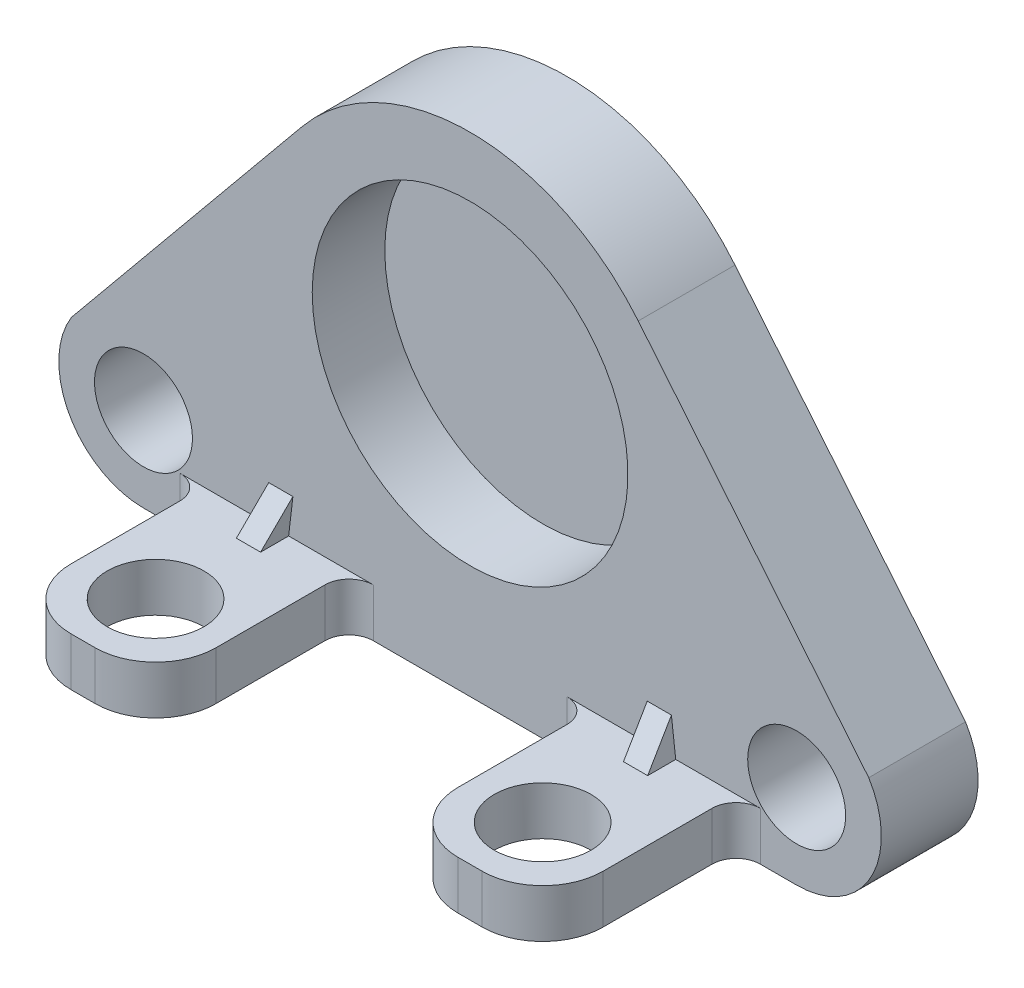
ISO-10303-21;
HEADER;
FILE_DESCRIPTION(('STEP AP214'),'2;1');
FILE_NAME('part.step','',(''),(''),'','','');
FILE_SCHEMA(('AUTOMOTIVE_DESIGN { 1 0 10303 214 1 1 1 1 }'));
ENDSEC;
DATA;
#1=APPLICATION_CONTEXT('core data for automotive mechanical design processes');
#2=APPLICATION_PROTOCOL_DEFINITION('international standard','automotive_design',2000,#1);
#3=PRODUCT_CONTEXT('',#1,'mechanical');
#4=PRODUCT('Part','Part','',(#3));
#5=PRODUCT_RELATED_PRODUCT_CATEGORY('part','',(#4));
#6=PRODUCT_DEFINITION_FORMATION('','',#4);
#7=PRODUCT_DEFINITION_CONTEXT('part definition',#1,'design');
#8=PRODUCT_DEFINITION('design','',#6,#7);
#9=PRODUCT_DEFINITION_SHAPE('','',#8);
#10=(LENGTH_UNIT() NAMED_UNIT(*) SI_UNIT(.MILLI.,.METRE.));
#11=(NAMED_UNIT(*) PLANE_ANGLE_UNIT() SI_UNIT($,.RADIAN.));
#12=(NAMED_UNIT(*) SI_UNIT($,.STERADIAN.) SOLID_ANGLE_UNIT());
#13=UNCERTAINTY_MEASURE_WITH_UNIT(LENGTH_MEASURE(1.E-05),#10,'distance_accuracy_value','');
#14=(GEOMETRIC_REPRESENTATION_CONTEXT(3) GLOBAL_UNCERTAINTY_ASSIGNED_CONTEXT((#13)) GLOBAL_UNIT_ASSIGNED_CONTEXT((#10,
#11,#12)) REPRESENTATION_CONTEXT('',''));
#15=CARTESIAN_POINT('',(0.,0.,0.));
#16=DIRECTION('',(0.,0.,1.));
#17=DIRECTION('',(1.,0.,0.));
#18=AXIS2_PLACEMENT_3D('',#15,#16,#17);
#19=CARTESIAN_POINT('',(-27.,-21.6152521873631,-25.));
#20=DIRECTION('',(0.,0.,-1.));
#21=DIRECTION('',(-1.,0.,0.));
#22=AXIS2_PLACEMENT_3D('',#19,#20,#21);
#23=PLANE('',#22);
#24=CARTESIAN_POINT('',(0.,-6.2,-25.));
#25=DIRECTION('',(0.,0.,-1.));
#26=DIRECTION('',(-1.,0.,0.));
#27=AXIS2_PLACEMENT_3D('',#24,#25,#26);
#28=CIRCLE('',#27,13.05);
#29=CARTESIAN_POINT('',(-13.05,-6.2,-25.));
#30=VERTEX_POINT('',#29);
#31=EDGE_CURVE('E378',#30,#30,#28,.T.);
#32=ORIENTED_EDGE('',*,*,#31,.T.);
#33=EDGE_LOOP('',(#32));
#34=FACE_BOUND('',#33,.T.);
#35=CARTESIAN_POINT('',(-27.,-21.6152521873631,-25.));
#36=DIRECTION('',(0.,0.,-1.));
#37=DIRECTION('',(1.,0.,0.));
#38=AXIS2_PLACEMENT_3D('',#35,#36,#37);
#39=CIRCLE('',#38,4.05);
#40=CARTESIAN_POINT('',(-22.95,-21.6152521873631,-25.));
#41=VERTEX_POINT('',#40);
#42=EDGE_CURVE('E383',#41,#41,#39,.T.);
#43=ORIENTED_EDGE('',*,*,#42,.T.);
#44=EDGE_LOOP('',(#43));
#45=FACE_BOUND('',#44,.T.);
#46=CARTESIAN_POINT('',(27.,-21.6152521873631,-25.));
#47=DIRECTION('',(0.,0.,-1.));
#48=DIRECTION('',(-1.,0.,0.));
#49=AXIS2_PLACEMENT_3D('',#46,#47,#48);
#50=CIRCLE('',#49,4.05);
#51=CARTESIAN_POINT('',(22.95,-21.6152521873631,-25.));
#52=VERTEX_POINT('',#51);
#53=EDGE_CURVE('E386',#52,#52,#50,.T.);
#54=ORIENTED_EDGE('',*,*,#53,.T.);
#55=EDGE_LOOP('',(#54));
#56=FACE_BOUND('',#55,.T.);
#57=DIRECTION('',(-1.,0.,0.));
#58=VECTOR('',#57,1.);
#59=CARTESIAN_POINT('',(22.,-24.615252187363,-25.));
#60=LINE('',#59,#58);
#61=CARTESIAN_POINT('',(15.,-24.6152521873631,-25.));
#62=VERTEX_POINT('',#61);
#63=CARTESIAN_POINT('',(8.00000000000001,-24.6152521873631,-25.));
#64=VERTEX_POINT('',#63);
#65=EDGE_CURVE('E36',#62,#64,#60,.T.);
#66=ORIENTED_EDGE('',*,*,#65,.F.);
#67=DIRECTION('',(-0.11733907517707,0.993091909863629,0.));
#68=VECTOR('',#67,1.);
#69=CARTESIAN_POINT('',(15.,-24.6152521873631,-25.));
#70=LINE('',#69,#68);
#71=CARTESIAN_POINT('',(14.6455340920262,-21.6152521873631,-25.));
#72=VERTEX_POINT('',#71);
#73=EDGE_CURVE('E283',#62,#72,#70,.T.);
#74=ORIENTED_EDGE('',*,*,#73,.T.);
#75=DIRECTION('',(-1.,0.,0.));
#76=VECTOR('',#75,1.);
#77=CARTESIAN_POINT('',(16.6455340920262,-21.6152521873631,-25.));
#78=LINE('',#77,#76);
#79=CARTESIAN_POINT('',(16.6455340920262,-21.6152521873631,-25.));
#80=VERTEX_POINT('',#79);
#81=EDGE_CURVE('E282',#80,#72,#78,.T.);
#82=ORIENTED_EDGE('',*,*,#81,.F.);
#83=DIRECTION('',(-0.11733907517707,0.993091909863629,0.));
#84=VECTOR('',#83,1.);
#85=CARTESIAN_POINT('',(17.,-24.6152521873631,-25.));
#86=LINE('',#85,#84);
#87=CARTESIAN_POINT('',(17.,-24.6152521873631,-25.));
#88=VERTEX_POINT('',#87);
#89=EDGE_CURVE('E279',#88,#80,#86,.T.);
#90=ORIENTED_EDGE('',*,*,#89,.F.);
#91=CARTESIAN_POINT('',(24.,-24.615252187363,-25.));
#92=VERTEX_POINT('',#91);
#93=EDGE_CURVE('E350',#92,#88,#60,.T.);
#94=ORIENTED_EDGE('',*,*,#93,.F.);
#95=DIRECTION('',(0.,1.,0.));
#96=VECTOR('',#95,1.);
#97=CARTESIAN_POINT('',(24.,-28.615252187363,-25.));
#98=LINE('',#97,#96);
#99=CARTESIAN_POINT('',(24.,-28.6152521873631,-25.));
#100=VERTEX_POINT('',#99);
#101=EDGE_CURVE('E425',#92,#100,#98,.F.);
#102=ORIENTED_EDGE('',*,*,#101,.T.);
#103=DIRECTION('',(-1.,0.,0.));
#104=VECTOR('',#103,1.);
#105=CARTESIAN_POINT('',(-27.,-28.6152521873631,-25.));
#106=LINE('',#105,#104);
#107=CARTESIAN_POINT('',(27.,-28.6152521873631,-25.));
#108=VERTEX_POINT('',#107);
#109=EDGE_CURVE('E399',#108,#100,#106,.T.);
#110=ORIENTED_EDGE('',*,*,#109,.F.);
#111=CARTESIAN_POINT('',(27.,-21.6152521873631,-25.));
#112=DIRECTION('',(0.,0.,-1.));
#113=DIRECTION('',(1.,0.,0.));
#114=AXIS2_PLACEMENT_3D('',#111,#112,#113);
#115=CIRCLE('',#114,7.);
#116=CARTESIAN_POINT('',(32.9572872292111,-17.9395578490538,-25.));
#117=VERTEX_POINT('',#116);
#118=EDGE_CURVE('E396',#117,#108,#115,.T.);
#119=ORIENTED_EDGE('',*,*,#118,.F.);
#120=DIRECTION('',(0.635136091171049,-0.772400249671089,0.));
#121=VECTOR('',#120,1.);
#122=CARTESIAN_POINT('',(13.9032044940796,5.23244964107887,-25.));
#123=LINE('',#122,#121);
#124=CARTESIAN_POINT('',(13.9032044940796,5.23244964107887,-25.));
#125=VERTEX_POINT('',#124);
#126=EDGE_CURVE('E394',#125,#117,#123,.T.);
#127=ORIENTED_EDGE('',*,*,#126,.F.);
#128=CARTESIAN_POINT('',(0.,-6.2,-25.));
#129=DIRECTION('',(0.,0.,-1.));
#130=DIRECTION('',(-1.,0.,0.));
#131=AXIS2_PLACEMENT_3D('',#128,#129,#130);
#132=CIRCLE('',#131,18.);
#133=CARTESIAN_POINT('',(-13.9032044940796,5.23244964107887,-25.));
#134=VERTEX_POINT('',#133);
#135=EDGE_CURVE('E392',#134,#125,#132,.T.);
#136=ORIENTED_EDGE('',*,*,#135,.F.);
#137=DIRECTION('',(0.635136091171049,0.772400249671089,0.));
#138=VECTOR('',#137,1.);
#139=CARTESIAN_POINT('',(-13.9032044940796,5.23244964107887,-25.));
#140=LINE('',#139,#138);
#141=CARTESIAN_POINT('',(-32.9572872292111,-17.9395578490538,-25.));
#142=VERTEX_POINT('',#141);
#143=EDGE_CURVE('E390',#142,#134,#140,.T.);
#144=ORIENTED_EDGE('',*,*,#143,.F.);
#145=CARTESIAN_POINT('',(-27.,-21.6152521873631,-25.));
#146=DIRECTION('',(0.,0.,-1.));
#147=DIRECTION('',(-1.,0.,0.));
#148=AXIS2_PLACEMENT_3D('',#145,#146,#147);
#149=CIRCLE('',#148,7.);
#150=CARTESIAN_POINT('',(-27.,-28.6152521873631,-25.));
#151=VERTEX_POINT('',#150);
#152=EDGE_CURVE('E229',#151,#142,#149,.T.);
#153=ORIENTED_EDGE('',*,*,#152,.F.);
#154=CARTESIAN_POINT('',(-24.,-28.6152521873631,-25.));
#155=VERTEX_POINT('',#154);
#156=EDGE_CURVE('E398',#155,#151,#106,.T.);
#157=ORIENTED_EDGE('',*,*,#156,.F.);
#158=DIRECTION('',(0.,-1.,0.));
#159=VECTOR('',#158,1.);
#160=CARTESIAN_POINT('',(-24.,-24.6152521873631,-25.));
#161=LINE('',#160,#159);
#162=CARTESIAN_POINT('',(-24.,-24.6152521873631,-25.));
#163=VERTEX_POINT('',#162);
#164=EDGE_CURVE('E417',#155,#163,#161,.F.);
#165=ORIENTED_EDGE('',*,*,#164,.T.);
#166=DIRECTION('',(-1.,0.,0.));
#167=VECTOR('',#166,1.);
#168=CARTESIAN_POINT('',(-22.,-24.6152521873631,-25.));
#169=LINE('',#168,#167);
#170=CARTESIAN_POINT('',(-17.,-24.6152521873631,-25.));
#171=VERTEX_POINT('',#170);
#172=EDGE_CURVE('E359',#171,#163,#169,.T.);
#173=ORIENTED_EDGE('',*,*,#172,.F.);
#174=DIRECTION('',(0.11733907517707,0.993091909863629,0.));
#175=VECTOR('',#174,1.);
#176=CARTESIAN_POINT('',(-17.,-24.6152521873631,-25.));
#177=LINE('',#176,#175);
#178=CARTESIAN_POINT('',(-16.6455340920262,-21.6152521873631,-25.));
#179=VERTEX_POINT('',#178);
#180=EDGE_CURVE('E58',#171,#179,#177,.T.);
#181=ORIENTED_EDGE('',*,*,#180,.T.);
#182=DIRECTION('',(1.,0.,0.));
#183=VECTOR('',#182,1.);
#184=CARTESIAN_POINT('',(-16.6455340920262,-21.6152521873631,-25.));
#185=LINE('',#184,#183);
#186=CARTESIAN_POINT('',(-14.6455340920262,-21.6152521873631,-25.));
#187=VERTEX_POINT('',#186);
#188=EDGE_CURVE('E313',#179,#187,#185,.T.);
#189=ORIENTED_EDGE('',*,*,#188,.T.);
#190=DIRECTION('',(0.11733907517707,0.993091909863629,0.));
#191=VECTOR('',#190,1.);
#192=CARTESIAN_POINT('',(-15.,-24.6152521873631,-25.));
#193=LINE('',#192,#191);
#194=CARTESIAN_POINT('',(-15.,-24.6152521873631,-25.));
#195=VERTEX_POINT('',#194);
#196=EDGE_CURVE('E317',#195,#187,#193,.T.);
#197=ORIENTED_EDGE('',*,*,#196,.F.);
#198=CARTESIAN_POINT('',(-7.99999999999999,-24.6152521873631,-25.));
#199=VERTEX_POINT('',#198);
#200=EDGE_CURVE('E362',#199,#195,#169,.T.);
#201=ORIENTED_EDGE('',*,*,#200,.F.);
#202=DIRECTION('',(0.,1.,0.));
#203=VECTOR('',#202,1.);
#204=CARTESIAN_POINT('',(-7.99999999999999,-28.6152521873631,-25.));
#205=LINE('',#204,#203);
#206=CARTESIAN_POINT('',(-8.,-28.6152521873631,-25.));
#207=VERTEX_POINT('',#206);
#208=EDGE_CURVE('E420',#199,#207,#205,.F.);
#209=ORIENTED_EDGE('',*,*,#208,.T.);
#210=CARTESIAN_POINT('',(8.,-28.6152521873631,-25.));
#211=VERTEX_POINT('',#210);
#212=EDGE_CURVE('E403',#211,#207,#106,.T.);
#213=ORIENTED_EDGE('',*,*,#212,.F.);
#214=DIRECTION('',(0.,-1.,0.));
#215=VECTOR('',#214,1.);
#216=CARTESIAN_POINT('',(8.00000000000001,-24.6152521873631,-25.));
#217=LINE('',#216,#215);
#218=EDGE_CURVE('E422',#211,#64,#217,.F.);
#219=ORIENTED_EDGE('',*,*,#218,.T.);
#220=EDGE_LOOP('',(#66,#74,#82,#90,#94,#102,#110,#119,#127,#136,#144,#153,#157,#165,#173,#181,
#189,#197,#201,#209,#213,#219));
#221=FACE_BOUND('',#220,.T.);
#222=ADVANCED_FACE('F32',(#34,#45,#56,#221),#23,.F.);
#223=CARTESIAN_POINT('',(-22.,-24.6152521873631,-9.));
#224=DIRECTION('',(0.,-1.,0.));
#225=DIRECTION('',(0.,0.,-1.));
#226=AXIS2_PLACEMENT_3D('',#223,#224,#225);
#227=PLANE('',#226);
#228=CARTESIAN_POINT('',(-16.,-24.6152521873631,-15.));
#229=DIRECTION('',(0.,1.,0.));
#230=DIRECTION('',(0.,0.,1.));
#231=AXIS2_PLACEMENT_3D('',#228,#229,#230);
#232=CIRCLE('',#231,4.);
#233=CARTESIAN_POINT('',(-16.,-24.6152521873631,-11.));
#234=VERTEX_POINT('',#233);
#235=EDGE_CURVE('E335',#234,#234,#232,.T.);
#236=ORIENTED_EDGE('',*,*,#235,.F.);
#237=EDGE_LOOP('',(#236));
#238=FACE_BOUND('',#237,.T.);
#239=DIRECTION('',(0.,0.,-1.));
#240=VECTOR('',#239,1.);
#241=CARTESIAN_POINT('',(-15.,-24.6152521873631,-22.68119573489));
#242=LINE('',#241,#240);
#243=CARTESIAN_POINT('',(-15.,-24.6152521873631,-22.68119573489));
#244=VERTEX_POINT('',#243);
#245=EDGE_CURVE('E308',#244,#195,#242,.T.);
#246=ORIENTED_EDGE('',*,*,#245,.F.);
#247=DIRECTION('',(1.,0.,0.));
#248=VECTOR('',#247,1.);
#249=CARTESIAN_POINT('',(-17.,-24.6152521873631,-22.68119573489));
#250=LINE('',#249,#248);
#251=CARTESIAN_POINT('',(-17.,-24.6152521873631,-22.68119573489));
#252=VERTEX_POINT('',#251);
#253=EDGE_CURVE('E299',#252,#244,#250,.T.);
#254=ORIENTED_EDGE('',*,*,#253,.F.);
#255=DIRECTION('',(0.,0.,-1.));
#256=VECTOR('',#255,1.);
#257=CARTESIAN_POINT('',(-17.,-24.6152521873631,-22.68119573489));
#258=LINE('',#257,#256);
#259=EDGE_CURVE('E305',#252,#171,#258,.T.);
#260=ORIENTED_EDGE('',*,*,#259,.T.);
#261=ORIENTED_EDGE('',*,*,#172,.T.);
#262=CARTESIAN_POINT('',(-24.,-24.6152521873631,-23.));
#263=DIRECTION('',(0.,-1.,0.));
#264=DIRECTION('',(0.,0.,-1.));
#265=AXIS2_PLACEMENT_3D('',#262,#263,#264);
#266=CIRCLE('',#265,2.);
#267=CARTESIAN_POINT('',(-22.,-24.6152521873631,-23.));
#268=VERTEX_POINT('',#267);
#269=EDGE_CURVE('E455',#163,#268,#266,.T.);
#270=ORIENTED_EDGE('',*,*,#269,.T.);
#271=DIRECTION('',(0.,0.,-1.));
#272=VECTOR('',#271,1.);
#273=CARTESIAN_POINT('',(-22.,-24.6152521873631,-9.));
#274=LINE('',#273,#272);
#275=CARTESIAN_POINT('',(-22.,-24.6152521873631,-14.));
#276=VERTEX_POINT('',#275);
#277=EDGE_CURVE('E369',#276,#268,#274,.T.);
#278=ORIENTED_EDGE('',*,*,#277,.F.);
#279=CARTESIAN_POINT('',(-17.,-24.6152521873631,-14.));
#280=DIRECTION('',(0.,-1.,0.));
#281=DIRECTION('',(0.,0.,-1.));
#282=AXIS2_PLACEMENT_3D('',#279,#280,#281);
#283=CIRCLE('',#282,5.);
#284=CARTESIAN_POINT('',(-17.,-24.6152521873631,-9.));
#285=VERTEX_POINT('',#284);
#286=EDGE_CURVE('E42',#276,#285,#283,.F.);
#287=ORIENTED_EDGE('',*,*,#286,.T.);
#288=DIRECTION('',(-1.,0.,0.));
#289=VECTOR('',#288,1.);
#290=CARTESIAN_POINT('',(-22.,-24.6152521873631,-9.));
#291=LINE('',#290,#289);
#292=CARTESIAN_POINT('',(-15.,-24.6152521873631,-9.));
#293=VERTEX_POINT('',#292);
#294=EDGE_CURVE('E367',#293,#285,#291,.T.);
#295=ORIENTED_EDGE('',*,*,#294,.F.);
#296=CARTESIAN_POINT('',(-15.,-24.6152521873631,-14.));
#297=DIRECTION('',(0.,-1.,0.));
#298=DIRECTION('',(0.,0.,-1.));
#299=AXIS2_PLACEMENT_3D('',#296,#297,#298);
#300=CIRCLE('',#299,5.);
#301=CARTESIAN_POINT('',(-9.99999999999999,-24.6152521873631,-14.));
#302=VERTEX_POINT('',#301);
#303=EDGE_CURVE('E488',#293,#302,#300,.F.);
#304=ORIENTED_EDGE('',*,*,#303,.T.);
#305=DIRECTION('',(0.,0.,-1.));
#306=VECTOR('',#305,1.);
#307=CARTESIAN_POINT('',(-9.99999999999999,-24.6152521873631,-9.));
#308=LINE('',#307,#306);
#309=CARTESIAN_POINT('',(-9.99999999999999,-24.6152521873631,-23.));
#310=VERTEX_POINT('',#309);
#311=EDGE_CURVE('E372',#302,#310,#308,.T.);
#312=ORIENTED_EDGE('',*,*,#311,.T.);
#313=CARTESIAN_POINT('',(-7.99999999999999,-24.6152521873631,-23.));
#314=DIRECTION('',(0.,-1.,0.));
#315=DIRECTION('',(0.,0.,-1.));
#316=AXIS2_PLACEMENT_3D('',#313,#314,#315);
#317=CIRCLE('',#316,2.);
#318=EDGE_CURVE('E447',#310,#199,#317,.T.);
#319=ORIENTED_EDGE('',*,*,#318,.T.);
#320=ORIENTED_EDGE('',*,*,#200,.T.);
#321=EDGE_LOOP('',(#246,#254,#260,#261,#270,#278,#287,#295,#304,#312,#319,#320));
#322=FACE_BOUND('',#321,.T.);
#323=ADVANCED_FACE('F495',(#238,#322),#227,.F.);
#324=CARTESIAN_POINT('',(-27.,-28.6152521873631,-31.));
#325=DIRECTION('',(0.,1.,0.));
#326=DIRECTION('',(0.,0.,1.));
#327=AXIS2_PLACEMENT_3D('',#324,#325,#326);
#328=PLANE('',#327);
#329=DIRECTION('',(0.,0.,-1.));
#330=VECTOR('',#329,1.);
#331=CARTESIAN_POINT('',(22.,-28.615252187363,-9.));
#332=LINE('',#331,#330);
#333=CARTESIAN_POINT('',(22.,-28.615252187363,-14.));
#334=VERTEX_POINT('',#333);
#335=CARTESIAN_POINT('',(22.,-28.615252187363,-23.));
#336=VERTEX_POINT('',#335);
#337=EDGE_CURVE('E352',#334,#336,#332,.T.);
#338=ORIENTED_EDGE('',*,*,#337,.F.);
#339=CARTESIAN_POINT('',(17.,-28.6152521873631,-14.));
#340=DIRECTION('',(0.,1.,0.));
#341=DIRECTION('',(0.,0.,1.));
#342=AXIS2_PLACEMENT_3D('',#339,#340,#341);
#343=CIRCLE('',#342,5.);
#344=CARTESIAN_POINT('',(17.,-28.615252187363,-9.));
#345=VERTEX_POINT('',#344);
#346=EDGE_CURVE('E476',#334,#345,#343,.F.);
#347=ORIENTED_EDGE('',*,*,#346,.T.);
#348=DIRECTION('',(1.,0.,0.));
#349=VECTOR('',#348,1.);
#350=CARTESIAN_POINT('',(22.,-28.615252187363,-9.));
#351=LINE('',#350,#349);
#352=CARTESIAN_POINT('',(15.,-28.6152521873631,-9.));
#353=VERTEX_POINT('',#352);
#354=EDGE_CURVE('E349',#353,#345,#351,.T.);
#355=ORIENTED_EDGE('',*,*,#354,.F.);
#356=CARTESIAN_POINT('',(15.,-28.6152521873631,-14.));
#357=DIRECTION('',(0.,1.,0.));
#358=DIRECTION('',(0.,0.,1.));
#359=AXIS2_PLACEMENT_3D('',#356,#357,#358);
#360=CIRCLE('',#359,5.);
#361=CARTESIAN_POINT('',(10.,-28.6152521873631,-14.));
#362=VERTEX_POINT('',#361);
#363=EDGE_CURVE('E474',#353,#362,#360,.F.);
#364=ORIENTED_EDGE('',*,*,#363,.T.);
#365=DIRECTION('',(0.,0.,-1.));
#366=VECTOR('',#365,1.);
#367=CARTESIAN_POINT('',(10.,-28.6152521873631,-9.));
#368=LINE('',#367,#366);
#369=CARTESIAN_POINT('',(10.,-28.6152521873631,-23.));
#370=VERTEX_POINT('',#369);
#371=EDGE_CURVE('E932',#362,#370,#368,.T.);
#372=ORIENTED_EDGE('',*,*,#371,.T.);
#373=CARTESIAN_POINT('',(8.00000000000001,-28.6152521873631,-23.));
#374=DIRECTION('',(0.,1.,0.));
#375=DIRECTION('',(0.,0.,1.));
#376=AXIS2_PLACEMENT_3D('',#373,#374,#375);
#377=CIRCLE('',#376,2.);
#378=EDGE_CURVE('E442',#370,#211,#377,.T.);
#379=ORIENTED_EDGE('',*,*,#378,.T.);
#380=ORIENTED_EDGE('',*,*,#212,.T.);
#381=CARTESIAN_POINT('',(-7.99999999999999,-28.6152521873631,-23.));
#382=DIRECTION('',(0.,1.,0.));
#383=DIRECTION('',(0.,0.,1.));
#384=AXIS2_PLACEMENT_3D('',#381,#382,#383);
#385=CIRCLE('',#384,2.);
#386=CARTESIAN_POINT('',(-9.99999999999999,-28.6152521873631,-23.));
#387=VERTEX_POINT('',#386);
#388=EDGE_CURVE('E450',#207,#387,#385,.T.);
#389=ORIENTED_EDGE('',*,*,#388,.T.);
#390=DIRECTION('',(0.,0.,-1.));
#391=VECTOR('',#390,1.);
#392=CARTESIAN_POINT('',(-9.99999999999999,-28.6152521873631,-9.));
#393=LINE('',#392,#391);
#394=CARTESIAN_POINT('',(-9.99999999999999,-28.6152521873631,-14.));
#395=VERTEX_POINT('',#394);
#396=EDGE_CURVE('E374',#395,#387,#393,.T.);
#397=ORIENTED_EDGE('',*,*,#396,.F.);
#398=CARTESIAN_POINT('',(-15.,-28.6152521873631,-14.));
#399=DIRECTION('',(0.,1.,0.));
#400=DIRECTION('',(0.,0.,1.));
#401=AXIS2_PLACEMENT_3D('',#398,#399,#400);
#402=CIRCLE('',#401,5.);
#403=CARTESIAN_POINT('',(-15.,-28.6152521873631,-9.));
#404=VERTEX_POINT('',#403);
#405=EDGE_CURVE('E470',#395,#404,#402,.F.);
#406=ORIENTED_EDGE('',*,*,#405,.T.);
#407=DIRECTION('',(1.,0.,0.));
#408=VECTOR('',#407,1.);
#409=CARTESIAN_POINT('',(-22.,-28.6152521873631,-9.));
#410=LINE('',#409,#408);
#411=CARTESIAN_POINT('',(-17.,-28.6152521873631,-9.));
#412=VERTEX_POINT('',#411);
#413=EDGE_CURVE('E504',#412,#404,#410,.T.);
#414=ORIENTED_EDGE('',*,*,#413,.F.);
#415=CARTESIAN_POINT('',(-17.,-28.6152521873631,-14.));
#416=DIRECTION('',(0.,1.,0.));
#417=DIRECTION('',(0.,0.,1.));
#418=AXIS2_PLACEMENT_3D('',#415,#416,#417);
#419=CIRCLE('',#418,5.);
#420=CARTESIAN_POINT('',(-22.,-28.6152521873631,-14.));
#421=VERTEX_POINT('',#420);
#422=EDGE_CURVE('E472',#412,#421,#419,.F.);
#423=ORIENTED_EDGE('',*,*,#422,.T.);
#424=DIRECTION('',(0.,0.,-1.));
#425=VECTOR('',#424,1.);
#426=CARTESIAN_POINT('',(-22.,-28.6152521873631,-9.));
#427=LINE('',#426,#425);
#428=CARTESIAN_POINT('',(-22.,-28.6152521873631,-23.));
#429=VERTEX_POINT('',#428);
#430=EDGE_CURVE('E376',#421,#429,#427,.T.);
#431=ORIENTED_EDGE('',*,*,#430,.T.);
#432=CARTESIAN_POINT('',(-24.,-28.6152521873631,-23.));
#433=DIRECTION('',(0.,1.,0.));
#434=DIRECTION('',(0.,0.,1.));
#435=AXIS2_PLACEMENT_3D('',#432,#433,#434);
#436=CIRCLE('',#435,2.);
#437=EDGE_CURVE('E453',#429,#155,#436,.T.);
#438=ORIENTED_EDGE('',*,*,#437,.T.);
#439=ORIENTED_EDGE('',*,*,#156,.T.);
#440=DIRECTION('',(0.,0.,1.));
#441=VECTOR('',#440,1.);
#442=CARTESIAN_POINT('',(-27.,-28.6152521873631,-31.));
#443=LINE('',#442,#441);
#444=CARTESIAN_POINT('',(-27.,-28.6152521873631,-33.));
#445=VERTEX_POINT('',#444);
#446=EDGE_CURVE('E402',#445,#151,#443,.T.);
#447=ORIENTED_EDGE('',*,*,#446,.F.);
#448=DIRECTION('',(-1.,0.,0.));
#449=VECTOR('',#448,1.);
#450=CARTESIAN_POINT('',(27.,-28.6152521873631,-33.));
#451=LINE('',#450,#449);
#452=CARTESIAN_POINT('',(27.,-28.6152521873631,-33.));
#453=VERTEX_POINT('',#452);
#454=EDGE_CURVE('E248',#453,#445,#451,.T.);
#455=ORIENTED_EDGE('',*,*,#454,.F.);
#456=DIRECTION('',(0.,0.,1.));
#457=VECTOR('',#456,1.);
#458=CARTESIAN_POINT('',(27.,-28.6152521873631,-31.));
#459=LINE('',#458,#457);
#460=EDGE_CURVE('E405',#453,#108,#459,.T.);
#461=ORIENTED_EDGE('',*,*,#460,.T.);
#462=ORIENTED_EDGE('',*,*,#109,.T.);
#463=CARTESIAN_POINT('',(24.,-28.6152521873631,-23.));
#464=DIRECTION('',(0.,1.,0.));
#465=DIRECTION('',(0.,0.,1.));
#466=AXIS2_PLACEMENT_3D('',#463,#464,#465);
#467=CIRCLE('',#466,2.);
#468=EDGE_CURVE('E439',#100,#336,#467,.T.);
#469=ORIENTED_EDGE('',*,*,#468,.T.);
#470=EDGE_LOOP('',(#338,#347,#355,#364,#372,#379,#380,#389,#397,#406,#414,#423,#431,#438,#439,
#447,#455,#461,#462,#469));
#471=FACE_BOUND('',#470,.T.);
#472=CARTESIAN_POINT('',(16.,-28.6152521873631,-15.));
#473=DIRECTION('',(0.,1.,0.));
#474=DIRECTION('',(0.,0.,1.));
#475=AXIS2_PLACEMENT_3D('',#472,#473,#474);
#476=CIRCLE('',#475,4.);
#477=CARTESIAN_POINT('',(16.,-28.6152521873631,-11.));
#478=VERTEX_POINT('',#477);
#479=EDGE_CURVE('E338',#478,#478,#476,.F.);
#480=ORIENTED_EDGE('',*,*,#479,.F.);
#481=EDGE_LOOP('',(#480));
#482=FACE_BOUND('',#481,.T.);
#483=CARTESIAN_POINT('',(-16.,-28.6152521873631,-15.));
#484=DIRECTION('',(0.,1.,0.));
#485=DIRECTION('',(0.,0.,1.));
#486=AXIS2_PLACEMENT_3D('',#483,#484,#485);
#487=CIRCLE('',#486,4.);
#488=CARTESIAN_POINT('',(-16.,-28.6152521873631,-11.));
#489=VERTEX_POINT('',#488);
#490=EDGE_CURVE('E343',#489,#489,#487,.T.);
#491=ORIENTED_EDGE('',*,*,#490,.T.);
#492=EDGE_LOOP('',(#491));
#493=FACE_BOUND('',#492,.T.);
#494=ADVANCED_FACE('F509',(#471,#482,#493),#328,.F.);
#495=CARTESIAN_POINT('',(-27.,-21.6152521873631,-31.));
#496=DIRECTION('',(0.,0.,1.));
#497=DIRECTION('',(1.,0.,0.));
#498=AXIS2_PLACEMENT_3D('',#495,#496,#497);
#499=CYLINDRICAL_SURFACE('',#498,7.);
#500=ORIENTED_EDGE('',*,*,#152,.T.);
#501=DIRECTION('',(0.,0.,1.));
#502=VECTOR('',#501,1.);
#503=CARTESIAN_POINT('',(-32.9572872292111,-17.9395578490538,-31.));
#504=LINE('',#503,#502);
#505=CARTESIAN_POINT('',(-32.9572872292111,-17.9395578490538,-33.));
#506=VERTEX_POINT('',#505);
#507=EDGE_CURVE('E222',#506,#142,#504,.T.);
#508=ORIENTED_EDGE('',*,*,#507,.F.);
#509=CARTESIAN_POINT('',(-27.,-21.6152521873631,-33.));
#510=DIRECTION('',(0.,0.,-1.));
#511=DIRECTION('',(-1.,0.,0.));
#512=AXIS2_PLACEMENT_3D('',#509,#510,#511);
#513=CIRCLE('',#512,7.);
#514=EDGE_CURVE('E227',#445,#506,#513,.T.);
#515=ORIENTED_EDGE('',*,*,#514,.F.);
#516=ORIENTED_EDGE('',*,*,#446,.T.);
#517=EDGE_LOOP('',(#500,#508,#515,#516));
#518=FACE_BOUND('',#517,.T.);
#519=ADVANCED_FACE('F224',(#518),#499,.T.);
#520=CARTESIAN_POINT('',(-13.9032044940796,5.23244964107887,-31.));
#521=DIRECTION('',(0.772400249671089,-0.635136091171049,0.));
#522=DIRECTION('',(0.635136091171049,0.772400249671089,0.));
#523=AXIS2_PLACEMENT_3D('',#520,#521,#522);
#524=PLANE('',#523);
#525=ORIENTED_EDGE('',*,*,#143,.T.);
#526=DIRECTION('',(0.,0.,1.));
#527=VECTOR('',#526,1.);
#528=CARTESIAN_POINT('',(-13.9032044940796,5.23244964107887,-31.));
#529=LINE('',#528,#527);
#530=CARTESIAN_POINT('',(-13.9032044940796,5.23244964107887,-33.));
#531=VERTEX_POINT('',#530);
#532=EDGE_CURVE('E232',#531,#134,#529,.T.);
#533=ORIENTED_EDGE('',*,*,#532,.F.);
#534=DIRECTION('',(0.635136091171049,0.772400249671089,0.));
#535=VECTOR('',#534,1.);
#536=CARTESIAN_POINT('',(-32.9572872292111,-17.9395578490538,-33.));
#537=LINE('',#536,#535);
#538=EDGE_CURVE('E235',#506,#531,#537,.T.);
#539=ORIENTED_EDGE('',*,*,#538,.F.);
#540=ORIENTED_EDGE('',*,*,#507,.T.);
#541=EDGE_LOOP('',(#525,#533,#539,#540));
#542=FACE_BOUND('',#541,.T.);
#543=ADVANCED_FACE('F236',(#542),#524,.F.);
#544=CARTESIAN_POINT('',(0.,-6.2,-31.));
#545=DIRECTION('',(0.,0.,1.));
#546=DIRECTION('',(1.,0.,0.));
#547=AXIS2_PLACEMENT_3D('',#544,#545,#546);
#548=CYLINDRICAL_SURFACE('',#547,18.);
#549=ORIENTED_EDGE('',*,*,#135,.T.);
#550=DIRECTION('',(0.,0.,1.));
#551=VECTOR('',#550,1.);
#552=CARTESIAN_POINT('',(13.9032044940796,5.23244964107887,-31.));
#553=LINE('',#552,#551);
#554=CARTESIAN_POINT('',(13.9032044940796,5.23244964107887,-33.));
#555=VERTEX_POINT('',#554);
#556=EDGE_CURVE('E411',#555,#125,#553,.T.);
#557=ORIENTED_EDGE('',*,*,#556,.F.);
#558=CARTESIAN_POINT('',(0.,-6.2,-33.));
#559=DIRECTION('',(0.,0.,-1.));
#560=DIRECTION('',(-1.,0.,0.));
#561=AXIS2_PLACEMENT_3D('',#558,#559,#560);
#562=CIRCLE('',#561,18.);
#563=EDGE_CURVE('E241',#531,#555,#562,.T.);
#564=ORIENTED_EDGE('',*,*,#563,.F.);
#565=ORIENTED_EDGE('',*,*,#532,.T.);
#566=EDGE_LOOP('',(#549,#557,#564,#565));
#567=FACE_BOUND('',#566,.T.);
#568=ADVANCED_FACE('F583',(#567),#548,.T.);
#569=CARTESIAN_POINT('',(13.9032044940796,5.23244964107887,-31.));
#570=DIRECTION('',(-0.772400249671089,-0.635136091171049,0.));
#571=DIRECTION('',(0.635136091171049,-0.772400249671089,0.));
#572=AXIS2_PLACEMENT_3D('',#569,#570,#571);
#573=PLANE('',#572);
#574=ORIENTED_EDGE('',*,*,#126,.T.);
#575=DIRECTION('',(0.,0.,1.));
#576=VECTOR('',#575,1.);
#577=CARTESIAN_POINT('',(32.9572872292111,-17.9395578490538,-31.));
#578=LINE('',#577,#576);
#579=CARTESIAN_POINT('',(32.9572872292111,-17.9395578490538,-33.));
#580=VERTEX_POINT('',#579);
#581=EDGE_CURVE('E408',#580,#117,#578,.T.);
#582=ORIENTED_EDGE('',*,*,#581,.F.);
#583=DIRECTION('',(0.635136091171049,-0.772400249671089,0.));
#584=VECTOR('',#583,1.);
#585=CARTESIAN_POINT('',(13.9032044940796,5.23244964107887,-33.));
#586=LINE('',#585,#584);
#587=EDGE_CURVE('E257',#555,#580,#586,.T.);
#588=ORIENTED_EDGE('',*,*,#587,.F.);
#589=ORIENTED_EDGE('',*,*,#556,.T.);
#590=EDGE_LOOP('',(#574,#582,#588,#589));
#591=FACE_BOUND('',#590,.T.);
#592=ADVANCED_FACE('F579',(#591),#573,.F.);
#593=CARTESIAN_POINT('',(27.,-21.6152521873631,-31.));
#594=DIRECTION('',(0.,0.,1.));
#595=DIRECTION('',(1.,0.,0.));
#596=AXIS2_PLACEMENT_3D('',#593,#594,#595);
#597=CYLINDRICAL_SURFACE('',#596,7.);
#598=ORIENTED_EDGE('',*,*,#118,.T.);
#599=ORIENTED_EDGE('',*,*,#460,.F.);
#600=CARTESIAN_POINT('',(27.,-21.6152521873631,-33.));
#601=DIRECTION('',(0.,0.,-1.));
#602=DIRECTION('',(-1.,0.,0.));
#603=AXIS2_PLACEMENT_3D('',#600,#601,#602);
#604=CIRCLE('',#603,7.);
#605=EDGE_CURVE('E260',#580,#453,#604,.T.);
#606=ORIENTED_EDGE('',*,*,#605,.F.);
#607=ORIENTED_EDGE('',*,*,#581,.T.);
#608=EDGE_LOOP('',(#598,#599,#606,#607));
#609=FACE_BOUND('',#608,.T.);
#610=ADVANCED_FACE('F576',(#609),#597,.T.);
#611=CARTESIAN_POINT('',(27.,-21.6152521873631,-31.));
#612=DIRECTION('',(0.,0.,1.));
#613=DIRECTION('',(1.,0.,0.));
#614=AXIS2_PLACEMENT_3D('',#611,#612,#613);
#615=CYLINDRICAL_SURFACE('',#614,4.05);
#616=ORIENTED_EDGE('',*,*,#53,.F.);
#617=EDGE_LOOP('',(#616));
#618=FACE_BOUND('',#617,.T.);
#619=CARTESIAN_POINT('',(27.,-21.6152521873631,-33.));
#620=DIRECTION('',(0.,0.,-1.));
#621=DIRECTION('',(-1.,0.,0.));
#622=AXIS2_PLACEMENT_3D('',#619,#620,#621);
#623=CIRCLE('',#622,4.05);
#624=CARTESIAN_POINT('',(22.95,-21.6152521873631,-33.));
#625=VERTEX_POINT('',#624);
#626=EDGE_CURVE('E249',#625,#625,#623,.T.);
#627=ORIENTED_EDGE('',*,*,#626,.T.);
#628=EDGE_LOOP('',(#627));
#629=FACE_BOUND('',#628,.T.);
#630=ADVANCED_FACE('F572',(#618,#629),#615,.F.);
#631=CARTESIAN_POINT('',(-27.,-21.6152521873631,-31.));
#632=DIRECTION('',(0.,0.,1.));
#633=DIRECTION('',(1.,0.,0.));
#634=AXIS2_PLACEMENT_3D('',#631,#632,#633);
#635=CYLINDRICAL_SURFACE('',#634,4.05);
#636=ORIENTED_EDGE('',*,*,#42,.F.);
#637=EDGE_LOOP('',(#636));
#638=FACE_BOUND('',#637,.T.);
#639=CARTESIAN_POINT('',(-27.,-21.6152521873631,-33.));
#640=DIRECTION('',(0.,0.,-1.));
#641=DIRECTION('',(-1.,0.,0.));
#642=AXIS2_PLACEMENT_3D('',#639,#640,#641);
#643=CIRCLE('',#642,4.05);
#644=CARTESIAN_POINT('',(-31.05,-21.6152521873631,-33.));
#645=VERTEX_POINT('',#644);
#646=EDGE_CURVE('E252',#645,#645,#643,.T.);
#647=ORIENTED_EDGE('',*,*,#646,.T.);
#648=EDGE_LOOP('',(#647));
#649=FACE_BOUND('',#648,.T.);
#650=ADVANCED_FACE('F656',(#638,#649),#635,.F.);
#651=CARTESIAN_POINT('',(0.,-6.2,-31.));
#652=DIRECTION('',(0.,0.,1.));
#653=DIRECTION('',(1.,0.,0.));
#654=AXIS2_PLACEMENT_3D('',#651,#652,#653);
#655=CYLINDRICAL_SURFACE('',#654,13.05);
#656=CARTESIAN_POINT('',(0.,-6.2,-31.));
#657=DIRECTION('',(0.,0.,-1.));
#658=DIRECTION('',(-1.,0.,0.));
#659=AXIS2_PLACEMENT_3D('',#656,#657,#658);
#660=CIRCLE('',#659,13.05);
#661=CARTESIAN_POINT('',(-13.05,-6.2,-31.));
#662=VERTEX_POINT('',#661);
#663=EDGE_CURVE('E263',#662,#662,#660,.T.);
#664=ORIENTED_EDGE('',*,*,#663,.T.);
#665=EDGE_LOOP('',(#664));
#666=FACE_BOUND('',#665,.T.);
#667=ORIENTED_EDGE('',*,*,#31,.F.);
#668=EDGE_LOOP('',(#667));
#669=FACE_BOUND('',#668,.T.);
#670=ADVANCED_FACE('F654',(#666,#669),#655,.F.);
#671=CARTESIAN_POINT('',(-22.,-28.6152521873631,-9.));
#672=DIRECTION('',(1.,0.,0.));
#673=DIRECTION('',(0.,1.,0.));
#674=AXIS2_PLACEMENT_3D('',#671,#672,#673);
#675=PLANE('',#674);
#676=ORIENTED_EDGE('',*,*,#430,.F.);
#677=DIRECTION('',(0.,-1.,0.));
#678=VECTOR('',#677,1.);
#679=CARTESIAN_POINT('',(-22.,-28.6152521873631,-14.));
#680=LINE('',#679,#678);
#681=EDGE_CURVE('E486',#421,#276,#680,.F.);
#682=ORIENTED_EDGE('',*,*,#681,.T.);
#683=ORIENTED_EDGE('',*,*,#277,.T.);
#684=DIRECTION('',(0.,-1.,0.));
#685=VECTOR('',#684,1.);
#686=CARTESIAN_POINT('',(-22.,-28.6152521873631,-23.));
#687=LINE('',#686,#685);
#688=EDGE_CURVE('E433',#268,#429,#687,.T.);
#689=ORIENTED_EDGE('',*,*,#688,.T.);
#690=EDGE_LOOP('',(#676,#682,#683,#689));
#691=FACE_BOUND('',#690,.T.);
#692=ADVANCED_FACE('F513',(#691),#675,.F.);
#693=CARTESIAN_POINT('',(-9.99999999999999,-28.6152521873631,-9.));
#694=DIRECTION('',(-1.,0.,0.));
#695=DIRECTION('',(0.,0.,1.));
#696=AXIS2_PLACEMENT_3D('',#693,#694,#695);
#697=PLANE('',#696);
#698=ORIENTED_EDGE('',*,*,#311,.F.);
#699=DIRECTION('',(0.,1.,0.));
#700=VECTOR('',#699,1.);
#701=CARTESIAN_POINT('',(-9.99999999999999,-28.6152521873631,-14.));
#702=LINE('',#701,#700);
#703=EDGE_CURVE('E11',#302,#395,#702,.F.);
#704=ORIENTED_EDGE('',*,*,#703,.T.);
#705=ORIENTED_EDGE('',*,*,#396,.T.);
#706=DIRECTION('',(0.,1.,0.));
#707=VECTOR('',#706,1.);
#708=CARTESIAN_POINT('',(-9.99999999999999,-24.6152521873631,-23.));
#709=LINE('',#708,#707);
#710=EDGE_CURVE('E430',#387,#310,#709,.T.);
#711=ORIENTED_EDGE('',*,*,#710,.T.);
#712=EDGE_LOOP('',(#698,#704,#705,#711));
#713=FACE_BOUND('',#712,.T.);
#714=ADVANCED_FACE('F534',(#713),#697,.F.);
#715=CARTESIAN_POINT('',(0.,0.,-9.));
#716=DIRECTION('',(0.,0.,-1.));
#717=DIRECTION('',(-1.,0.,0.));
#718=AXIS2_PLACEMENT_3D('',#715,#716,#717);
#719=PLANE('',#718);
#720=ORIENTED_EDGE('',*,*,#294,.T.);
#721=DIRECTION('',(0.,-1.,0.));
#722=VECTOR('',#721,1.);
#723=CARTESIAN_POINT('',(-17.,0.,-9.));
#724=LINE('',#723,#722);
#725=EDGE_CURVE('E483',#285,#412,#724,.T.);
#726=ORIENTED_EDGE('',*,*,#725,.T.);
#727=ORIENTED_EDGE('',*,*,#413,.T.);
#728=DIRECTION('',(0.,1.,0.));
#729=VECTOR('',#728,1.);
#730=CARTESIAN_POINT('',(-15.,0.,-9.));
#731=LINE('',#730,#729);
#732=EDGE_CURVE('E480',#404,#293,#731,.T.);
#733=ORIENTED_EDGE('',*,*,#732,.T.);
#734=EDGE_LOOP('',(#720,#726,#727,#733));
#735=FACE_BOUND('',#734,.T.);
#736=ADVANCED_FACE('F500',(#735),#719,.F.);
#737=CARTESIAN_POINT('',(22.,-28.615252187363,-9.));
#738=DIRECTION('',(-1.,0.,0.));
#739=DIRECTION('',(0.,-1.,0.));
#740=AXIS2_PLACEMENT_3D('',#737,#738,#739);
#741=PLANE('',#740);
#742=DIRECTION('',(0.,0.,-1.));
#743=VECTOR('',#742,1.);
#744=CARTESIAN_POINT('',(22.,-24.615252187363,-9.));
#745=LINE('',#744,#743);
#746=CARTESIAN_POINT('',(22.,-24.615252187363,-14.));
#747=VERTEX_POINT('',#746);
#748=CARTESIAN_POINT('',(22.,-24.615252187363,-23.));
#749=VERTEX_POINT('',#748);
#750=EDGE_CURVE('E363',#747,#749,#745,.T.);
#751=ORIENTED_EDGE('',*,*,#750,.F.);
#752=DIRECTION('',(0.,1.,0.));
#753=VECTOR('',#752,1.);
#754=CARTESIAN_POINT('',(22.,-28.615252187363,-14.));
#755=LINE('',#754,#753);
#756=EDGE_CURVE('E468',#747,#334,#755,.F.);
#757=ORIENTED_EDGE('',*,*,#756,.T.);
#758=ORIENTED_EDGE('',*,*,#337,.T.);
#759=DIRECTION('',(0.,1.,0.));
#760=VECTOR('',#759,1.);
#761=CARTESIAN_POINT('',(22.,-24.615252187363,-23.));
#762=LINE('',#761,#760);
#763=EDGE_CURVE('E231',#336,#749,#762,.T.);
#764=ORIENTED_EDGE('',*,*,#763,.T.);
#765=EDGE_LOOP('',(#751,#757,#758,#764));
#766=FACE_BOUND('',#765,.T.);
#767=ADVANCED_FACE('F643',(#766),#741,.F.);
#768=CARTESIAN_POINT('',(22.,-24.615252187363,-9.));
#769=DIRECTION('',(0.,-1.,0.));
#770=DIRECTION('',(1.,0.,0.));
#771=AXIS2_PLACEMENT_3D('',#768,#769,#770);
#772=PLANE('',#771);
#773=DIRECTION('',(-1.,0.,0.));
#774=VECTOR('',#773,1.);
#775=CARTESIAN_POINT('',(17.,-24.6152521873631,-22.68119573489));
#776=LINE('',#775,#774);
#777=CARTESIAN_POINT('',(17.,-24.6152521873631,-22.68119573489));
#778=VERTEX_POINT('',#777);
#779=CARTESIAN_POINT('',(15.,-24.6152521873631,-22.68119573489));
#780=VERTEX_POINT('',#779);
#781=EDGE_CURVE('E264',#778,#780,#776,.T.);
#782=ORIENTED_EDGE('',*,*,#781,.T.);
#783=DIRECTION('',(0.,0.,-1.));
#784=VECTOR('',#783,1.);
#785=CARTESIAN_POINT('',(15.,-24.6152521873631,-22.68119573489));
#786=LINE('',#785,#784);
#787=EDGE_CURVE('E50',#780,#62,#786,.T.);
#788=ORIENTED_EDGE('',*,*,#787,.T.);
#789=ORIENTED_EDGE('',*,*,#65,.T.);
#790=CARTESIAN_POINT('',(8.00000000000001,-24.6152521873631,-23.));
#791=DIRECTION('',(0.,-1.,0.));
#792=DIRECTION('',(1.,0.,0.));
#793=AXIS2_PLACEMENT_3D('',#790,#791,#792);
#794=CIRCLE('',#793,2.);
#795=CARTESIAN_POINT('',(10.,-24.6152521873631,-23.));
#796=VERTEX_POINT('',#795);
#797=EDGE_CURVE('E444',#64,#796,#794,.T.);
#798=ORIENTED_EDGE('',*,*,#797,.T.);
#799=DIRECTION('',(0.,0.,-1.));
#800=VECTOR('',#799,1.);
#801=CARTESIAN_POINT('',(10.,-24.6152521873631,-9.));
#802=LINE('',#801,#800);
#803=CARTESIAN_POINT('',(10.,-24.6152521873631,-14.));
#804=VERTEX_POINT('',#803);
#805=EDGE_CURVE('E933',#804,#796,#802,.T.);
#806=ORIENTED_EDGE('',*,*,#805,.F.);
#807=CARTESIAN_POINT('',(15.,-24.6152521873631,-14.));
#808=DIRECTION('',(0.,-1.,0.));
#809=DIRECTION('',(1.,0.,0.));
#810=AXIS2_PLACEMENT_3D('',#807,#808,#809);
#811=CIRCLE('',#810,5.);
#812=CARTESIAN_POINT('',(15.,-24.6152521873631,-9.));
#813=VERTEX_POINT('',#812);
#814=EDGE_CURVE('E464',#804,#813,#811,.F.);
#815=ORIENTED_EDGE('',*,*,#814,.T.);
#816=DIRECTION('',(-1.,0.,0.));
#817=VECTOR('',#816,1.);
#818=CARTESIAN_POINT('',(22.,-24.615252187363,-9.));
#819=LINE('',#818,#817);
#820=CARTESIAN_POINT('',(17.,-24.615252187363,-9.));
#821=VERTEX_POINT('',#820);
#822=EDGE_CURVE('E346',#821,#813,#819,.T.);
#823=ORIENTED_EDGE('',*,*,#822,.F.);
#824=CARTESIAN_POINT('',(17.,-24.615252187363,-14.));
#825=DIRECTION('',(0.,-1.,0.));
#826=DIRECTION('',(1.,0.,0.));
#827=AXIS2_PLACEMENT_3D('',#824,#825,#826);
#828=CIRCLE('',#827,5.);
#829=EDGE_CURVE('E466',#821,#747,#828,.F.);
#830=ORIENTED_EDGE('',*,*,#829,.T.);
#831=ORIENTED_EDGE('',*,*,#750,.T.);
#832=CARTESIAN_POINT('',(24.,-24.615252187363,-23.));
#833=DIRECTION('',(0.,-1.,0.));
#834=DIRECTION('',(1.,0.,0.));
#835=AXIS2_PLACEMENT_3D('',#832,#833,#834);
#836=CIRCLE('',#835,2.);
#837=EDGE_CURVE('E436',#749,#92,#836,.T.);
#838=ORIENTED_EDGE('',*,*,#837,.T.);
#839=ORIENTED_EDGE('',*,*,#93,.T.);
#840=DIRECTION('',(0.,0.,-1.));
#841=VECTOR('',#840,1.);
#842=CARTESIAN_POINT('',(17.,-24.6152521873631,-22.68119573489));
#843=LINE('',#842,#841);
#844=EDGE_CURVE('E274',#778,#88,#843,.T.);
#845=ORIENTED_EDGE('',*,*,#844,.F.);
#846=EDGE_LOOP('',(#782,#788,#789,#798,#806,#815,#823,#830,#831,#838,#839,#845));
#847=FACE_BOUND('',#846,.T.);
#848=CARTESIAN_POINT('',(16.,-24.6152521873631,-15.));
#849=DIRECTION('',(0.,-1.,0.));
#850=DIRECTION('',(0.,0.,-1.));
#851=AXIS2_PLACEMENT_3D('',#848,#849,#850);
#852=CIRCLE('',#851,4.);
#853=CARTESIAN_POINT('',(16.,-24.6152521873631,-19.));
#854=VERTEX_POINT('',#853);
#855=EDGE_CURVE('E307',#854,#854,#852,.T.);
#856=ORIENTED_EDGE('',*,*,#855,.T.);
#857=EDGE_LOOP('',(#856));
#858=FACE_BOUND('',#857,.T.);
#859=ADVANCED_FACE('F639',(#847,#858),#772,.F.);
#860=CARTESIAN_POINT('',(10.,-28.6152521873631,-9.));
#861=DIRECTION('',(1.,0.,0.));
#862=DIRECTION('',(0.,0.,-1.));
#863=AXIS2_PLACEMENT_3D('',#860,#861,#862);
#864=PLANE('',#863);
#865=ORIENTED_EDGE('',*,*,#371,.F.);
#866=DIRECTION('',(0.,-1.,0.));
#867=VECTOR('',#866,1.);
#868=CARTESIAN_POINT('',(10.,-24.6152521873631,-14.));
#869=LINE('',#868,#867);
#870=EDGE_CURVE('E478',#362,#804,#869,.F.);
#871=ORIENTED_EDGE('',*,*,#870,.T.);
#872=ORIENTED_EDGE('',*,*,#805,.T.);
#873=DIRECTION('',(0.,-1.,0.));
#874=VECTOR('',#873,1.);
#875=CARTESIAN_POINT('',(10.,-28.6152521873631,-23.));
#876=LINE('',#875,#874);
#877=EDGE_CURVE('E427',#796,#370,#876,.T.);
#878=ORIENTED_EDGE('',*,*,#877,.T.);
#879=EDGE_LOOP('',(#865,#871,#872,#878));
#880=FACE_BOUND('',#879,.T.);
#881=ADVANCED_FACE('F635',(#880),#864,.F.);
#882=CARTESIAN_POINT('',(0.,0.,-9.));
#883=DIRECTION('',(0.,0.,1.));
#884=DIRECTION('',(1.,0.,0.));
#885=AXIS2_PLACEMENT_3D('',#882,#883,#884);
#886=PLANE('',#885);
#887=ORIENTED_EDGE('',*,*,#354,.T.);
#888=DIRECTION('',(0.,1.,0.));
#889=VECTOR('',#888,1.);
#890=CARTESIAN_POINT('',(17.,-24.6152521873631,-9.));
#891=LINE('',#890,#889);
#892=EDGE_CURVE('E461',#345,#821,#891,.T.);
#893=ORIENTED_EDGE('',*,*,#892,.T.);
#894=ORIENTED_EDGE('',*,*,#822,.T.);
#895=DIRECTION('',(0.,-1.,0.));
#896=VECTOR('',#895,1.);
#897=CARTESIAN_POINT('',(15.,-28.6152521873631,-9.));
#898=LINE('',#897,#896);
#899=EDGE_CURVE('E458',#813,#353,#898,.T.);
#900=ORIENTED_EDGE('',*,*,#899,.T.);
#901=EDGE_LOOP('',(#887,#893,#894,#900));
#902=FACE_BOUND('',#901,.T.);
#903=ADVANCED_FACE('F596',(#902),#886,.T.);
#904=CARTESIAN_POINT('',(24.,-28.615252187363,-23.));
#905=DIRECTION('',(0.,-1.,0.));
#906=DIRECTION('',(1.,0.,0.));
#907=AXIS2_PLACEMENT_3D('',#904,#905,#906);
#908=CYLINDRICAL_SURFACE('',#907,2.);
#909=ORIENTED_EDGE('',*,*,#468,.F.);
#910=ORIENTED_EDGE('',*,*,#101,.F.);
#911=ORIENTED_EDGE('',*,*,#837,.F.);
#912=ORIENTED_EDGE('',*,*,#763,.F.);
#913=EDGE_LOOP('',(#909,#910,#911,#912));
#914=FACE_BOUND('',#913,.T.);
#915=ADVANCED_FACE('F592',(#914),#908,.F.);
#916=CARTESIAN_POINT('',(8.00000000000001,-28.6152521873631,-23.));
#917=DIRECTION('',(0.,1.,0.));
#918=DIRECTION('',(0.,0.,1.));
#919=AXIS2_PLACEMENT_3D('',#916,#917,#918);
#920=CYLINDRICAL_SURFACE('',#919,2.);
#921=ORIENTED_EDGE('',*,*,#797,.F.);
#922=ORIENTED_EDGE('',*,*,#218,.F.);
#923=ORIENTED_EDGE('',*,*,#378,.F.);
#924=ORIENTED_EDGE('',*,*,#877,.F.);
#925=EDGE_LOOP('',(#921,#922,#923,#924));
#926=FACE_BOUND('',#925,.T.);
#927=ADVANCED_FACE('F595',(#926),#920,.F.);
#928=CARTESIAN_POINT('',(-7.99999999999999,-28.6152521873631,-23.));
#929=DIRECTION('',(0.,-1.,0.));
#930=DIRECTION('',(0.,0.,-1.));
#931=AXIS2_PLACEMENT_3D('',#928,#929,#930);
#932=CYLINDRICAL_SURFACE('',#931,2.);
#933=ORIENTED_EDGE('',*,*,#388,.F.);
#934=ORIENTED_EDGE('',*,*,#208,.F.);
#935=ORIENTED_EDGE('',*,*,#318,.F.);
#936=ORIENTED_EDGE('',*,*,#710,.F.);
#937=EDGE_LOOP('',(#933,#934,#935,#936));
#938=FACE_BOUND('',#937,.T.);
#939=ADVANCED_FACE('F530',(#938),#932,.F.);
#940=CARTESIAN_POINT('',(-24.,-28.6152521873631,-23.));
#941=DIRECTION('',(0.,1.,0.));
#942=DIRECTION('',(-1.,0.,0.));
#943=AXIS2_PLACEMENT_3D('',#940,#941,#942);
#944=CYLINDRICAL_SURFACE('',#943,2.);
#945=ORIENTED_EDGE('',*,*,#269,.F.);
#946=ORIENTED_EDGE('',*,*,#164,.F.);
#947=ORIENTED_EDGE('',*,*,#437,.F.);
#948=ORIENTED_EDGE('',*,*,#688,.F.);
#949=EDGE_LOOP('',(#945,#946,#947,#948));
#950=FACE_BOUND('',#949,.T.);
#951=ADVANCED_FACE('F517',(#950),#944,.F.);
#952=CARTESIAN_POINT('',(17.,0.,-14.));
#953=DIRECTION('',(0.,-1.,0.));
#954=DIRECTION('',(1.,0.,0.));
#955=AXIS2_PLACEMENT_3D('',#952,#953,#954);
#956=CYLINDRICAL_SURFACE('',#955,5.);
#957=ORIENTED_EDGE('',*,*,#346,.F.);
#958=ORIENTED_EDGE('',*,*,#756,.F.);
#959=ORIENTED_EDGE('',*,*,#829,.F.);
#960=ORIENTED_EDGE('',*,*,#892,.F.);
#961=EDGE_LOOP('',(#957,#958,#959,#960));
#962=FACE_BOUND('',#961,.T.);
#963=ADVANCED_FACE('F605',(#962),#956,.T.);
#964=CARTESIAN_POINT('',(15.,0.,-14.));
#965=DIRECTION('',(0.,1.,0.));
#966=DIRECTION('',(0.,0.,1.));
#967=AXIS2_PLACEMENT_3D('',#964,#965,#966);
#968=CYLINDRICAL_SURFACE('',#967,5.);
#969=ORIENTED_EDGE('',*,*,#814,.F.);
#970=ORIENTED_EDGE('',*,*,#870,.F.);
#971=ORIENTED_EDGE('',*,*,#363,.F.);
#972=ORIENTED_EDGE('',*,*,#899,.F.);
#973=EDGE_LOOP('',(#969,#970,#971,#972));
#974=FACE_BOUND('',#973,.T.);
#975=ADVANCED_FACE('F608',(#974),#968,.T.);
#976=CARTESIAN_POINT('',(-17.,0.,-14.));
#977=DIRECTION('',(0.,-1.,0.));
#978=DIRECTION('',(1.,0.,0.));
#979=AXIS2_PLACEMENT_3D('',#976,#977,#978);
#980=CYLINDRICAL_SURFACE('',#979,5.);
#981=ORIENTED_EDGE('',*,*,#286,.F.);
#982=ORIENTED_EDGE('',*,*,#681,.F.);
#983=ORIENTED_EDGE('',*,*,#422,.F.);
#984=ORIENTED_EDGE('',*,*,#725,.F.);
#985=EDGE_LOOP('',(#981,#982,#983,#984));
#986=FACE_BOUND('',#985,.T.);
#987=ADVANCED_FACE('F505',(#986),#980,.T.);
#988=CARTESIAN_POINT('',(-15.,0.,-14.));
#989=DIRECTION('',(0.,1.,0.));
#990=DIRECTION('',(0.,0.,1.));
#991=AXIS2_PLACEMENT_3D('',#988,#989,#990);
#992=CYLINDRICAL_SURFACE('',#991,5.);
#993=ORIENTED_EDGE('',*,*,#405,.F.);
#994=ORIENTED_EDGE('',*,*,#703,.F.);
#995=ORIENTED_EDGE('',*,*,#303,.F.);
#996=ORIENTED_EDGE('',*,*,#732,.F.);
#997=EDGE_LOOP('',(#993,#994,#995,#996));
#998=FACE_BOUND('',#997,.T.);
#999=ADVANCED_FACE('F34',(#998),#992,.T.);
#1000=CARTESIAN_POINT('',(16.,-34.6152521873631,-15.));
#1001=DIRECTION('',(0.,1.,0.));
#1002=DIRECTION('',(0.,0.,1.));
#1003=AXIS2_PLACEMENT_3D('',#1000,#1001,#1002);
#1004=CYLINDRICAL_SURFACE('',#1003,4.);
#1005=ORIENTED_EDGE('',*,*,#855,.F.);
#1006=EDGE_LOOP('',(#1005));
#1007=FACE_BOUND('',#1006,.T.);
#1008=ORIENTED_EDGE('',*,*,#479,.T.);
#1009=EDGE_LOOP('',(#1008));
#1010=FACE_BOUND('',#1009,.T.);
#1011=ADVANCED_FACE('F617',(#1007,#1010),#1004,.F.);
#1012=CARTESIAN_POINT('',(-16.,-34.6152521873631,-15.));
#1013=DIRECTION('',(0.,1.,0.));
#1014=DIRECTION('',(0.,0.,1.));
#1015=AXIS2_PLACEMENT_3D('',#1012,#1013,#1014);
#1016=CYLINDRICAL_SURFACE('',#1015,4.);
#1017=ORIENTED_EDGE('',*,*,#235,.T.);
#1018=EDGE_LOOP('',(#1017));
#1019=FACE_BOUND('',#1018,.T.);
#1020=ORIENTED_EDGE('',*,*,#490,.F.);
#1021=EDGE_LOOP('',(#1020));
#1022=FACE_BOUND('',#1021,.T.);
#1023=ADVANCED_FACE('F557',(#1019,#1022),#1016,.F.);
#1024=CARTESIAN_POINT('',(-11.8975581278934,1.6420701868073,0.));
#1025=DIRECTION('',(-0.993091909863629,0.11733907517707,0.));
#1026=DIRECTION('',(-0.11733907517707,-0.993091909863629,0.));
#1027=AXIS2_PLACEMENT_3D('',#1024,#1025,#1026);
#1028=PLANE('',#1027);
#1029=ORIENTED_EDGE('',*,*,#245,.T.);
#1030=ORIENTED_EDGE('',*,*,#196,.T.);
#1031=DIRECTION('',(0.0930792864094206,0.78777070783611,-0.60889535908636));
#1032=VECTOR('',#1031,1.);
#1033=CARTESIAN_POINT('',(-15.,-24.6152521873631,-22.68119573489));
#1034=LINE('',#1033,#1032);
#1035=EDGE_CURVE('E276',#244,#187,#1034,.T.);
#1036=ORIENTED_EDGE('',*,*,#1035,.F.);
#1037=EDGE_LOOP('',(#1029,#1030,#1036));
#1038=FACE_BOUND('',#1037,.T.);
#1039=ADVANCED_FACE('F541',(#1038),#1028,.F.);
#1040=CARTESIAN_POINT('',(-13.8975581278934,1.6420701868073,0.));
#1041=DIRECTION('',(-0.993091909863629,0.11733907517707,0.));
#1042=DIRECTION('',(-0.11733907517707,-0.993091909863629,0.));
#1043=AXIS2_PLACEMENT_3D('',#1040,#1041,#1042);
#1044=PLANE('',#1043);
#1045=ORIENTED_EDGE('',*,*,#259,.F.);
#1046=DIRECTION('',(0.0930792864094206,0.78777070783611,-0.60889535908636));
#1047=VECTOR('',#1046,1.);
#1048=CARTESIAN_POINT('',(-17.,-24.6152521873631,-22.68119573489));
#1049=LINE('',#1048,#1047);
#1050=EDGE_CURVE('E302',#252,#179,#1049,.T.);
#1051=ORIENTED_EDGE('',*,*,#1050,.T.);
#1052=ORIENTED_EDGE('',*,*,#180,.F.);
#1053=EDGE_LOOP('',(#1045,#1051,#1052));
#1054=FACE_BOUND('',#1053,.T.);
#1055=ADVANCED_FACE('F547',(#1054),#1044,.T.);
#1056=CARTESIAN_POINT('',(-17.,-24.6152521873631,-22.68119573489));
#1057=DIRECTION('',(0.,-0.611550282464031,-0.791205568748201));
#1058=DIRECTION('',(0.,0.791205568748201,-0.611550282464031));
#1059=AXIS2_PLACEMENT_3D('',#1056,#1057,#1058);
#1060=PLANE('',#1059);
#1061=ORIENTED_EDGE('',*,*,#1035,.T.);
#1062=ORIENTED_EDGE('',*,*,#188,.F.);
#1063=ORIENTED_EDGE('',*,*,#1050,.F.);
#1064=ORIENTED_EDGE('',*,*,#253,.T.);
#1065=EDGE_LOOP('',(#1061,#1062,#1063,#1064));
#1066=FACE_BOUND('',#1065,.T.);
#1067=ADVANCED_FACE('F543',(#1066),#1060,.F.);
#1068=CARTESIAN_POINT('',(11.8975581278932,1.64207018680732,0.));
#1069=DIRECTION('',(-0.993091909863628,-0.117339075177073,0.));
#1070=DIRECTION('',(0.117339075177073,-0.993091909863628,0.));
#1071=AXIS2_PLACEMENT_3D('',#1068,#1069,#1070);
#1072=PLANE('',#1071);
#1073=ORIENTED_EDGE('',*,*,#787,.F.);
#1074=DIRECTION('',(-0.0930792864094206,0.78777070783611,-0.60889535908636));
#1075=VECTOR('',#1074,1.);
#1076=CARTESIAN_POINT('',(15.,-24.6152521873631,-22.68119573489));
#1077=LINE('',#1076,#1075);
#1078=EDGE_CURVE('E268',#780,#72,#1077,.T.);
#1079=ORIENTED_EDGE('',*,*,#1078,.T.);
#1080=ORIENTED_EDGE('',*,*,#73,.F.);
#1081=EDGE_LOOP('',(#1073,#1079,#1080));
#1082=FACE_BOUND('',#1081,.T.);
#1083=ADVANCED_FACE('F555',(#1082),#1072,.T.);
#1084=CARTESIAN_POINT('',(13.8975581278932,1.64207018680732,0.));
#1085=DIRECTION('',(-0.993091909863628,-0.117339075177073,0.));
#1086=DIRECTION('',(0.117339075177073,-0.993091909863628,0.));
#1087=AXIS2_PLACEMENT_3D('',#1084,#1085,#1086);
#1088=PLANE('',#1087);
#1089=ORIENTED_EDGE('',*,*,#844,.T.);
#1090=ORIENTED_EDGE('',*,*,#89,.T.);
#1091=DIRECTION('',(-0.0930792864094206,0.78777070783611,-0.60889535908636));
#1092=VECTOR('',#1091,1.);
#1093=CARTESIAN_POINT('',(17.,-24.6152521873631,-22.68119573489));
#1094=LINE('',#1093,#1092);
#1095=EDGE_CURVE('E267',#778,#80,#1094,.T.);
#1096=ORIENTED_EDGE('',*,*,#1095,.F.);
#1097=EDGE_LOOP('',(#1089,#1090,#1096));
#1098=FACE_BOUND('',#1097,.T.);
#1099=ADVANCED_FACE('F683',(#1098),#1088,.F.);
#1100=CARTESIAN_POINT('',(17.,-24.6152521873631,-22.68119573489));
#1101=DIRECTION('',(0.,0.611550282464031,0.791205568748201));
#1102=DIRECTION('',(0.,-0.791205568748201,0.611550282464031));
#1103=AXIS2_PLACEMENT_3D('',#1100,#1101,#1102);
#1104=PLANE('',#1103);
#1105=ORIENTED_EDGE('',*,*,#1078,.F.);
#1106=ORIENTED_EDGE('',*,*,#781,.F.);
#1107=ORIENTED_EDGE('',*,*,#1095,.T.);
#1108=ORIENTED_EDGE('',*,*,#81,.T.);
#1109=EDGE_LOOP('',(#1105,#1106,#1107,#1108));
#1110=FACE_BOUND('',#1109,.T.);
#1111=ADVANCED_FACE('F559',(#1110),#1104,.T.);
#1112=CARTESIAN_POINT('',(-27.,-21.6152521873631,-31.));
#1113=DIRECTION('',(0.,0.,-1.));
#1114=DIRECTION('',(-1.,0.,0.));
#1115=AXIS2_PLACEMENT_3D('',#1112,#1113,#1114);
#1116=PLANE('',#1115);
#1117=ORIENTED_EDGE('',*,*,#663,.F.);
#1118=EDGE_LOOP('',(#1117));
#1119=FACE_BOUND('',#1118,.T.);
#1120=ADVANCED_FACE('F670',(#1119),#1116,.F.);
#1121=CARTESIAN_POINT('',(-27.,-21.6152521873631,-33.));
#1122=DIRECTION('',(0.,0.,-1.));
#1123=DIRECTION('',(-1.,0.,0.));
#1124=AXIS2_PLACEMENT_3D('',#1121,#1122,#1123);
#1125=PLANE('',#1124);
#1126=ORIENTED_EDGE('',*,*,#626,.F.);
#1127=EDGE_LOOP('',(#1126));
#1128=FACE_BOUND('',#1127,.T.);
#1129=ORIENTED_EDGE('',*,*,#514,.T.);
#1130=ORIENTED_EDGE('',*,*,#538,.T.);
#1131=ORIENTED_EDGE('',*,*,#563,.T.);
#1132=ORIENTED_EDGE('',*,*,#587,.T.);
#1133=ORIENTED_EDGE('',*,*,#605,.T.);
#1134=ORIENTED_EDGE('',*,*,#454,.T.);
#1135=EDGE_LOOP('',(#1129,#1130,#1131,#1132,#1133,#1134));
#1136=FACE_BOUND('',#1135,.T.);
#1137=ORIENTED_EDGE('',*,*,#646,.F.);
#1138=EDGE_LOOP('',(#1137));
#1139=FACE_BOUND('',#1138,.T.);
#1140=ADVANCED_FACE('F244',(#1128,#1136,#1139),#1125,.T.);
#1141=CLOSED_SHELL('',(#222,#323,#494,#519,#543,#568,#592,#610,#630,#650,#670,#692,#714,#736,
#767,#859,#881,#903,#915,#927,#939,#951,#963,#975,#987,#999,#1011,#1023,#1039,#1055,#1067,#1083,
#1099,#1111,#1120,#1140));
#1142=MANIFOLD_SOLID_BREP('B2',#1141);
#1143=ADVANCED_BREP_SHAPE_REPRESENTATION('',(#18,#1142),#14);
#1144=SHAPE_DEFINITION_REPRESENTATION(#9,#1143);
ENDSEC;
END-ISO-10303-21;
